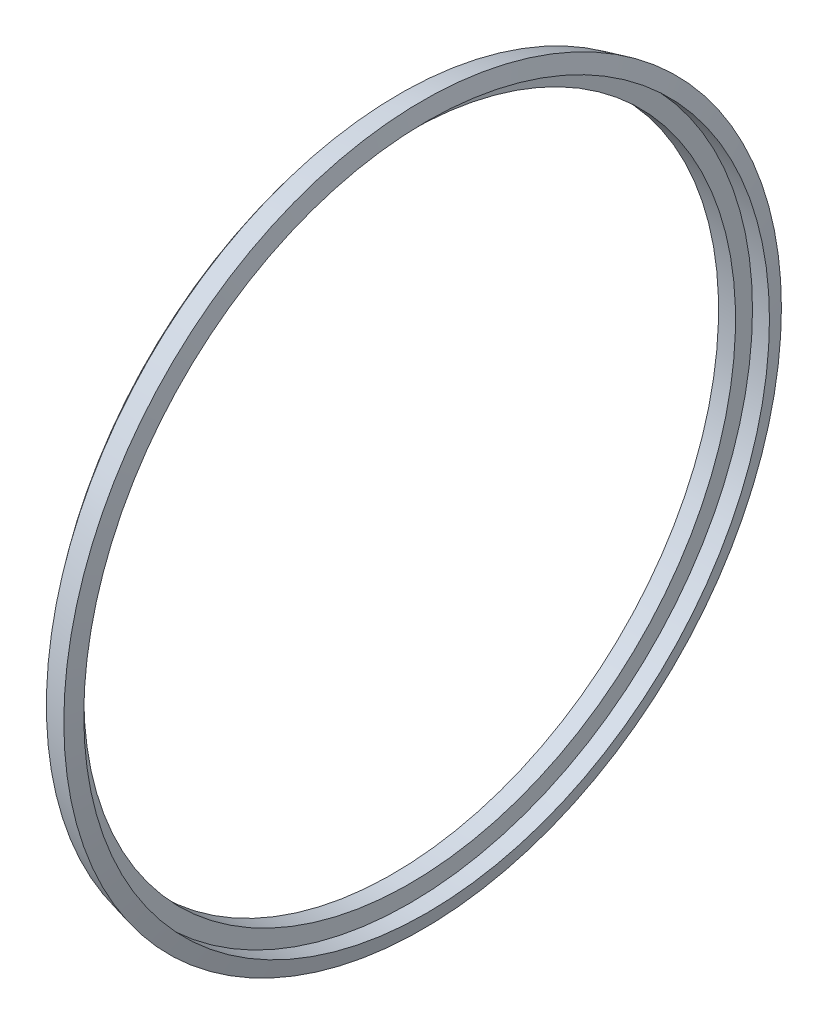
ISO-10303-21;
HEADER;
FILE_DESCRIPTION(('STEP AP214'),'2;1');
FILE_NAME('part.step','',(''),(''),'','','');
FILE_SCHEMA(('AUTOMOTIVE_DESIGN { 1 0 10303 214 1 1 1 1 }'));
ENDSEC;
DATA;
#1=APPLICATION_CONTEXT('core data for automotive mechanical design processes');
#2=APPLICATION_PROTOCOL_DEFINITION('international standard','automotive_design',2000,#1);
#3=PRODUCT_CONTEXT('',#1,'mechanical');
#4=PRODUCT('Part','Part','',(#3));
#5=PRODUCT_RELATED_PRODUCT_CATEGORY('part','',(#4));
#6=PRODUCT_DEFINITION_FORMATION('','',#4);
#7=PRODUCT_DEFINITION_CONTEXT('part definition',#1,'design');
#8=PRODUCT_DEFINITION('design','',#6,#7);
#9=PRODUCT_DEFINITION_SHAPE('','',#8);
#10=(LENGTH_UNIT() NAMED_UNIT(*) SI_UNIT(.MILLI.,.METRE.));
#11=(NAMED_UNIT(*) PLANE_ANGLE_UNIT() SI_UNIT($,.RADIAN.));
#12=(NAMED_UNIT(*) SI_UNIT($,.STERADIAN.) SOLID_ANGLE_UNIT());
#13=UNCERTAINTY_MEASURE_WITH_UNIT(LENGTH_MEASURE(1.E-05),#10,'distance_accuracy_value','');
#14=(GEOMETRIC_REPRESENTATION_CONTEXT(3) GLOBAL_UNCERTAINTY_ASSIGNED_CONTEXT((#13)) GLOBAL_UNIT_ASSIGNED_CONTEXT((#10,
#11,#12)) REPRESENTATION_CONTEXT('',''));
#15=CARTESIAN_POINT('',(0.,0.,0.));
#16=DIRECTION('',(0.,0.,1.));
#17=DIRECTION('',(1.,0.,0.));
#18=AXIS2_PLACEMENT_3D('',#15,#16,#17);
#19=CARTESIAN_POINT('',(49.9999999999995,0.,2.22044604925031E-13));
#20=DIRECTION('',(-1.,0.,0.));
#21=DIRECTION('',(0.,0.,1.));
#22=AXIS2_PLACEMENT_3D('',#19,#20,#21);
#23=CYLINDRICAL_SURFACE('',#22,30.738666666667);
#24=CARTESIAN_POINT('',(0.772999999999913,0.,0.));
#25=DIRECTION('',(-1.,0.,0.));
#26=DIRECTION('',(0.,0.,1.));
#27=AXIS2_PLACEMENT_3D('',#24,#25,#26);
#28=CIRCLE('',#27,30.738666666667);
#29=CARTESIAN_POINT('',(0.772999999999919,0.,30.738666666667));
#30=VERTEX_POINT('',#29);
#31=EDGE_CURVE('E30',#30,#30,#28,.T.);
#32=ORIENTED_EDGE('',*,*,#31,.F.);
#33=EDGE_LOOP('',(#32));
#34=FACE_BOUND('',#33,.T.);
#35=CARTESIAN_POINT('',(-0.747166666666854,0.,0.));
#36=DIRECTION('',(-1.,0.,0.));
#37=DIRECTION('',(0.,0.,1.));
#38=AXIS2_PLACEMENT_3D('',#35,#36,#37);
#39=CIRCLE('',#38,30.738666666667);
#40=CARTESIAN_POINT('',(-0.747166666666847,0.,30.738666666667));
#41=VERTEX_POINT('',#40);
#42=EDGE_CURVE('E18',#41,#41,#39,.T.);
#43=ORIENTED_EDGE('',*,*,#42,.T.);
#44=EDGE_LOOP('',(#43));
#45=FACE_BOUND('',#44,.T.);
#46=ADVANCED_FACE('F15',(#34,#45),#23,.F.);
#47=CARTESIAN_POINT('',(0.415313725489863,0.,4.44089209850063E-13));
#48=DIRECTION('',(-1.,0.,0.));
#49=DIRECTION('',(0.,0.,1.));
#50=AXIS2_PLACEMENT_3D('',#47,#48,#49);
#51=CONICAL_SURFACE('',#50,32.169411764706,1.325817663668);
#52=ORIENTED_EDGE('',*,*,#31,.T.);
#53=EDGE_LOOP('',(#52));
#54=FACE_BOUND('',#53,.T.);
#55=CARTESIAN_POINT('',(0.415313725489863,0.,4.44089209850063E-13));
#56=DIRECTION('',(1.,0.,0.));
#57=DIRECTION('',(0.,0.,-1.));
#58=AXIS2_PLACEMENT_3D('',#55,#56,#57);
#59=CIRCLE('',#58,32.169411764706);
#60=CARTESIAN_POINT('',(0.415313725489867,0.,-32.1694117647056));
#61=VERTEX_POINT('',#60);
#62=EDGE_CURVE('E34',#61,#61,#59,.F.);
#63=ORIENTED_EDGE('',*,*,#62,.F.);
#64=EDGE_LOOP('',(#63));
#65=FACE_BOUND('',#64,.T.);
#66=ADVANCED_FACE('F48',(#54,#65),#51,.T.);
#67=CARTESIAN_POINT('',(-0.747166666666854,29.2185,2.22044604925031E-13));
#68=DIRECTION('',(-1.,0.,0.));
#69=DIRECTION('',(0.,0.,1.));
#70=AXIS2_PLACEMENT_3D('',#67,#68,#69);
#71=PLANE('',#70);
#72=CARTESIAN_POINT('',(-0.747166666666854,0.,0.));
#73=DIRECTION('',(-1.,0.,0.));
#74=DIRECTION('',(0.,0.,1.));
#75=AXIS2_PLACEMENT_3D('',#72,#73,#74);
#76=CIRCLE('',#75,29.2185);
#77=CARTESIAN_POINT('',(-0.747166666666848,0.,29.2185));
#78=VERTEX_POINT('',#77);
#79=EDGE_CURVE('E32',#78,#78,#76,.T.);
#80=ORIENTED_EDGE('',*,*,#79,.T.);
#81=EDGE_LOOP('',(#80));
#82=FACE_BOUND('',#81,.T.);
#83=ORIENTED_EDGE('',*,*,#42,.F.);
#84=EDGE_LOOP('',(#83));
#85=FACE_BOUND('',#84,.T.);
#86=ADVANCED_FACE('F56',(#82,#85),#71,.F.);
#87=CARTESIAN_POINT('',(0.415313725489863,0.,4.44089209850063E-13));
#88=DIRECTION('',(1.,0.,0.));
#89=DIRECTION('',(0.,1.,0.));
#90=AXIS2_PLACEMENT_3D('',#87,#88,#89);
#91=CONICAL_SURFACE('',#90,32.169411764706,0.244978663126774);
#92=CARTESIAN_POINT('',(-1.66823151665474,-2.22044604925031E-13,4.44089209850063E-13));
#93=DIRECTION('',(1.,0.,0.));
#94=DIRECTION('',(0.,0.,-1.));
#95=AXIS2_PLACEMENT_3D('',#92,#93,#94);
#96=CIRCLE('',#95,31.64852545417);
#97=CARTESIAN_POINT('',(-1.66823151665475,-2.08868259304536E-13,-31.6485254541696));
#98=VERTEX_POINT('',#97);
#99=EDGE_CURVE('E27',#98,#98,#96,.F.);
#100=ORIENTED_EDGE('',*,*,#99,.F.);
#101=EDGE_LOOP('',(#100));
#102=FACE_BOUND('',#101,.T.);
#103=ORIENTED_EDGE('',*,*,#62,.T.);
#104=EDGE_LOOP('',(#103));
#105=FACE_BOUND('',#104,.T.);
#106=ADVANCED_FACE('F71',(#102,#105),#91,.T.);
#107=CARTESIAN_POINT('',(49.9999999999995,0.,2.22044604925031E-13));
#108=DIRECTION('',(-1.,0.,0.));
#109=DIRECTION('',(0.,0.,1.));
#110=AXIS2_PLACEMENT_3D('',#107,#108,#109);
#111=CYLINDRICAL_SURFACE('',#110,29.2185);
#112=ORIENTED_EDGE('',*,*,#79,.F.);
#113=EDGE_LOOP('',(#112));
#114=FACE_BOUND('',#113,.T.);
#115=CARTESIAN_POINT('',(-2.26733333333318,0.,-2.22044604925031E-13));
#116=DIRECTION('',(-1.,0.,0.));
#117=DIRECTION('',(0.,0.,1.));
#118=AXIS2_PLACEMENT_3D('',#115,#116,#117);
#119=CIRCLE('',#118,29.2185);
#120=CARTESIAN_POINT('',(-2.26733333333317,0.,29.2184999999998));
#121=VERTEX_POINT('',#120);
#122=EDGE_CURVE('E22',#121,#121,#119,.T.);
#123=ORIENTED_EDGE('',*,*,#122,.T.);
#124=EDGE_LOOP('',(#123));
#125=FACE_BOUND('',#124,.T.);
#126=ADVANCED_FACE('F65',(#114,#125),#111,.F.);
#127=CARTESIAN_POINT('',(-1.66823151665474,-2.22044604925031E-13,4.44089209850063E-13));
#128=DIRECTION('',(1.,0.,0.));
#129=DIRECTION('',(0.,0.,-1.));
#130=AXIS2_PLACEMENT_3D('',#127,#128,#129);
#131=CONICAL_SURFACE('',#130,31.64852545417,0.907887494960813);
#132=CARTESIAN_POINT('',(-2.26733333333318,0.,-2.22044604925031E-13));
#133=DIRECTION('',(1.,0.,0.));
#134=DIRECTION('',(0.,0.,-1.));
#135=AXIS2_PLACEMENT_3D('',#132,#133,#134);
#136=CIRCLE('',#135,30.881209982334);
#137=CARTESIAN_POINT('',(-2.26733333333318,0.,-30.8812099823342));
#138=VERTEX_POINT('',#137);
#139=EDGE_CURVE('E10',#138,#138,#136,.T.);
#140=ORIENTED_EDGE('',*,*,#139,.T.);
#141=EDGE_LOOP('',(#140));
#142=FACE_BOUND('',#141,.T.);
#143=ORIENTED_EDGE('',*,*,#99,.T.);
#144=EDGE_LOOP('',(#143));
#145=FACE_BOUND('',#144,.T.);
#146=ADVANCED_FACE('F59',(#142,#145),#131,.T.);
#147=CARTESIAN_POINT('',(-2.2673333333334,30.8812099823341,-2.22044604925031E-13));
#148=DIRECTION('',(1.,0.,0.));
#149=DIRECTION('',(0.,0.,-1.));
#150=AXIS2_PLACEMENT_3D('',#147,#148,#149);
#151=PLANE('',#150);
#152=ORIENTED_EDGE('',*,*,#139,.F.);
#153=EDGE_LOOP('',(#152));
#154=FACE_BOUND('',#153,.T.);
#155=ORIENTED_EDGE('',*,*,#122,.F.);
#156=EDGE_LOOP('',(#155));
#157=FACE_BOUND('',#156,.T.);
#158=ADVANCED_FACE('F57',(#154,#157),#151,.F.);
#159=CLOSED_SHELL('',(#46,#66,#86,#106,#126,#146,#158));
#160=MANIFOLD_SOLID_BREP('B1',#159);
#161=ADVANCED_BREP_SHAPE_REPRESENTATION('',(#18,#160),#14);
#162=SHAPE_DEFINITION_REPRESENTATION(#9,#161);
ENDSEC;
END-ISO-10303-21;
